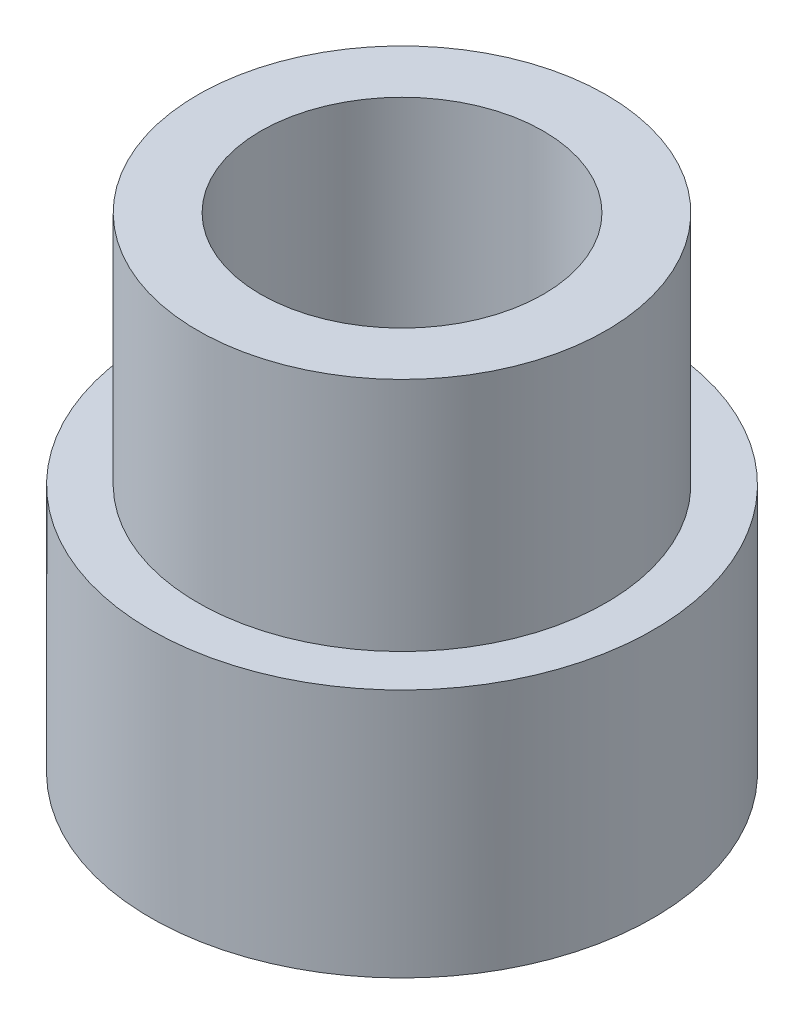
ISO-10303-21;
HEADER;
FILE_DESCRIPTION(('STEP AP214'),'2;1');
FILE_NAME('part.step','',(''),(''),'','','');
FILE_SCHEMA(('AUTOMOTIVE_DESIGN { 1 0 10303 214 1 1 1 1 }'));
ENDSEC;
DATA;
#1=APPLICATION_CONTEXT('core data for automotive mechanical design processes');
#2=APPLICATION_PROTOCOL_DEFINITION('international standard','automotive_design',2000,#1);
#3=PRODUCT_CONTEXT('',#1,'mechanical');
#4=PRODUCT('Part','Part','',(#3));
#5=PRODUCT_RELATED_PRODUCT_CATEGORY('part','',(#4));
#6=PRODUCT_DEFINITION_FORMATION('','',#4);
#7=PRODUCT_DEFINITION_CONTEXT('part definition',#1,'design');
#8=PRODUCT_DEFINITION('design','',#6,#7);
#9=PRODUCT_DEFINITION_SHAPE('','',#8);
#10=(LENGTH_UNIT() NAMED_UNIT(*) SI_UNIT(.MILLI.,.METRE.));
#11=(NAMED_UNIT(*) PLANE_ANGLE_UNIT() SI_UNIT($,.RADIAN.));
#12=(NAMED_UNIT(*) SI_UNIT($,.STERADIAN.) SOLID_ANGLE_UNIT());
#13=UNCERTAINTY_MEASURE_WITH_UNIT(LENGTH_MEASURE(1.E-05),#10,'distance_accuracy_value','');
#14=(GEOMETRIC_REPRESENTATION_CONTEXT(3) GLOBAL_UNCERTAINTY_ASSIGNED_CONTEXT((#13)) GLOBAL_UNIT_ASSIGNED_CONTEXT((#10,
#11,#12)) REPRESENTATION_CONTEXT('',''));
#15=CARTESIAN_POINT('',(0.,0.,0.));
#16=DIRECTION('',(0.,0.,1.));
#17=DIRECTION('',(1.,0.,0.));
#18=AXIS2_PLACEMENT_3D('',#15,#16,#17);
#19=CARTESIAN_POINT('',(0.,10.,0.));
#20=DIRECTION('',(0.,-1.,0.));
#21=DIRECTION('',(0.,0.,-1.));
#22=AXIS2_PLACEMENT_3D('',#19,#20,#21);
#23=CYLINDRICAL_SURFACE('',#22,4.6355);
#24=CARTESIAN_POINT('',(0.,-10.16,0.));
#25=DIRECTION('',(0.,-1.,0.));
#26=DIRECTION('',(0.,0.,-1.));
#27=AXIS2_PLACEMENT_3D('',#24,#25,#26);
#28=CIRCLE('',#27,4.6355);
#29=CARTESIAN_POINT('',(0.,-10.16,-4.6355));
#30=VERTEX_POINT('',#29);
#31=EDGE_CURVE('E53',#30,#30,#28,.T.);
#32=ORIENTED_EDGE('',*,*,#31,.T.);
#33=EDGE_LOOP('',(#32));
#34=FACE_BOUND('',#33,.T.);
#35=CARTESIAN_POINT('',(0.,-3.5,0.));
#36=DIRECTION('',(0.,1.,0.));
#37=DIRECTION('',(0.,0.,1.));
#38=AXIS2_PLACEMENT_3D('',#35,#36,#37);
#39=CIRCLE('',#38,4.6355);
#40=CARTESIAN_POINT('',(0.,-3.5,4.6355));
#41=VERTEX_POINT('',#40);
#42=EDGE_CURVE('E34',#41,#41,#39,.T.);
#43=ORIENTED_EDGE('',*,*,#42,.T.);
#44=EDGE_LOOP('',(#43));
#45=FACE_BOUND('',#44,.T.);
#46=ADVANCED_FACE('F30',(#34,#45),#23,.F.);
#47=CARTESIAN_POINT('',(0.,10.,0.));
#48=DIRECTION('',(0.,1.,0.));
#49=DIRECTION('',(0.,0.,1.));
#50=AXIS2_PLACEMENT_3D('',#47,#48,#49);
#51=PLANE('',#50);
#52=CARTESIAN_POINT('',(0.,10.,0.));
#53=DIRECTION('',(0.,1.,0.));
#54=DIRECTION('',(0.,0.,1.));
#55=AXIS2_PLACEMENT_3D('',#52,#53,#54);
#56=CIRCLE('',#55,16.51);
#57=CARTESIAN_POINT('',(0.,10.,-16.51));
#58=VERTEX_POINT('',#57);
#59=EDGE_CURVE('E10',#58,#58,#56,.T.);
#60=ORIENTED_EDGE('',*,*,#59,.F.);
#61=EDGE_LOOP('',(#60));
#62=FACE_BOUND('',#61,.T.);
#63=CARTESIAN_POINT('',(0.,10.,0.));
#64=DIRECTION('',(0.,1.,0.));
#65=DIRECTION('',(0.,0.,1.));
#66=AXIS2_PLACEMENT_3D('',#63,#64,#65);
#67=CIRCLE('',#66,20.32);
#68=CARTESIAN_POINT('',(0.,10.,20.32));
#69=VERTEX_POINT('',#68);
#70=EDGE_CURVE('E38',#69,#69,#67,.T.);
#71=ORIENTED_EDGE('',*,*,#70,.T.);
#72=EDGE_LOOP('',(#71));
#73=FACE_BOUND('',#72,.T.);
#74=ADVANCED_FACE('F81',(#62,#73),#51,.T.);
#75=CARTESIAN_POINT('',(0.,10.,0.));
#76=DIRECTION('',(0.,-1.,0.));
#77=DIRECTION('',(0.,0.,-1.));
#78=AXIS2_PLACEMENT_3D('',#75,#76,#77);
#79=CYLINDRICAL_SURFACE('',#78,20.32);
#80=ORIENTED_EDGE('',*,*,#70,.F.);
#81=EDGE_LOOP('',(#80));
#82=FACE_BOUND('',#81,.T.);
#83=CARTESIAN_POINT('',(0.,-10.16,0.));
#84=DIRECTION('',(0.,-1.,0.));
#85=DIRECTION('',(0.,0.,-1.));
#86=AXIS2_PLACEMENT_3D('',#83,#84,#85);
#87=CIRCLE('',#86,20.32);
#88=CARTESIAN_POINT('',(0.,-10.16,-20.32));
#89=VERTEX_POINT('',#88);
#90=EDGE_CURVE('E50',#89,#89,#87,.T.);
#91=ORIENTED_EDGE('',*,*,#90,.F.);
#92=EDGE_LOOP('',(#91));
#93=FACE_BOUND('',#92,.T.);
#94=ADVANCED_FACE('F32',(#82,#93),#79,.T.);
#95=CARTESIAN_POINT('',(0.,29.05,0.));
#96=DIRECTION('',(0.,1.,0.));
#97=DIRECTION('',(0.,0.,1.));
#98=AXIS2_PLACEMENT_3D('',#95,#96,#97);
#99=PLANE('',#98);
#100=CARTESIAN_POINT('',(0.,29.05,0.));
#101=DIRECTION('',(0.,1.,0.));
#102=DIRECTION('',(0.,0.,1.));
#103=AXIS2_PLACEMENT_3D('',#100,#101,#102);
#104=CIRCLE('',#103,16.51);
#105=CARTESIAN_POINT('',(0.,29.05,-16.51));
#106=VERTEX_POINT('',#105);
#107=EDGE_CURVE('E43',#106,#106,#104,.T.);
#108=ORIENTED_EDGE('',*,*,#107,.T.);
#109=EDGE_LOOP('',(#108));
#110=FACE_BOUND('',#109,.T.);
#111=CARTESIAN_POINT('',(0.,29.05,0.));
#112=DIRECTION('',(0.,1.,0.));
#113=DIRECTION('',(0.,0.,1.));
#114=AXIS2_PLACEMENT_3D('',#111,#112,#113);
#115=CIRCLE('',#114,11.43);
#116=CARTESIAN_POINT('',(0.,29.05,-11.43));
#117=VERTEX_POINT('',#116);
#118=EDGE_CURVE('E47',#117,#117,#115,.T.);
#119=ORIENTED_EDGE('',*,*,#118,.F.);
#120=EDGE_LOOP('',(#119));
#121=FACE_BOUND('',#120,.T.);
#122=ADVANCED_FACE('F93',(#110,#121),#99,.T.);
#123=CARTESIAN_POINT('',(0.,29.05,0.));
#124=DIRECTION('',(0.,-1.,0.));
#125=DIRECTION('',(0.,0.,-1.));
#126=AXIS2_PLACEMENT_3D('',#123,#124,#125);
#127=CYLINDRICAL_SURFACE('',#126,16.51);
#128=CARTESIAN_POINT('',(0.,29.05,-16.51));
#129=CARTESIAN_POINT('',(0.,28.8515625,-16.51));
#130=CARTESIAN_POINT('',(0.,28.653125,-16.51));
#131=CARTESIAN_POINT('',(0.,28.25625,-16.51));
#132=CARTESIAN_POINT('',(0.,28.0578125,-16.51));
#133=CARTESIAN_POINT('',(0.,27.6609375,-16.51));
#134=CARTESIAN_POINT('',(0.,27.4625,-16.51));
#135=CARTESIAN_POINT('',(0.,27.065625,-16.51));
#136=CARTESIAN_POINT('',(0.,26.8671875,-16.51));
#137=CARTESIAN_POINT('',(0.,26.4703125,-16.51));
#138=CARTESIAN_POINT('',(0.,26.271875,-16.51));
#139=CARTESIAN_POINT('',(0.,25.875,-16.51));
#140=CARTESIAN_POINT('',(0.,25.6765625,-16.51));
#141=CARTESIAN_POINT('',(0.,25.2796875,-16.51));
#142=CARTESIAN_POINT('',(0.,25.08125,-16.51));
#143=CARTESIAN_POINT('',(0.,24.684375,-16.51));
#144=CARTESIAN_POINT('',(0.,24.4859375,-16.51));
#145=CARTESIAN_POINT('',(0.,24.0890625,-16.51));
#146=CARTESIAN_POINT('',(0.,23.890625,-16.51));
#147=CARTESIAN_POINT('',(0.,23.49375,-16.51));
#148=CARTESIAN_POINT('',(0.,23.2953125,-16.51));
#149=CARTESIAN_POINT('',(0.,22.8984375,-16.51));
#150=CARTESIAN_POINT('',(0.,22.7,-16.51));
#151=CARTESIAN_POINT('',(0.,22.303125,-16.51));
#152=CARTESIAN_POINT('',(0.,22.1046875,-16.51));
#153=CARTESIAN_POINT('',(0.,21.7078125,-16.51));
#154=CARTESIAN_POINT('',(0.,21.509375,-16.51));
#155=CARTESIAN_POINT('',(0.,21.1125,-16.51));
#156=CARTESIAN_POINT('',(0.,20.9140625,-16.51));
#157=CARTESIAN_POINT('',(0.,20.5171875,-16.51));
#158=CARTESIAN_POINT('',(0.,20.31875,-16.51));
#159=CARTESIAN_POINT('',(0.,19.921875,-16.51));
#160=CARTESIAN_POINT('',(0.,19.7234375,-16.51));
#161=CARTESIAN_POINT('',(0.,19.3265625,-16.51));
#162=CARTESIAN_POINT('',(0.,19.128125,-16.51));
#163=CARTESIAN_POINT('',(0.,18.73125,-16.51));
#164=CARTESIAN_POINT('',(0.,18.5328125,-16.51));
#165=CARTESIAN_POINT('',(0.,18.1359375,-16.51));
#166=CARTESIAN_POINT('',(0.,17.9375,-16.51));
#167=CARTESIAN_POINT('',(0.,17.540625,-16.51));
#168=CARTESIAN_POINT('',(0.,17.3421875,-16.51));
#169=CARTESIAN_POINT('',(0.,16.9453125,-16.51));
#170=CARTESIAN_POINT('',(0.,16.746875,-16.51));
#171=CARTESIAN_POINT('',(0.,16.35,-16.51));
#172=CARTESIAN_POINT('',(0.,16.1515625,-16.51));
#173=CARTESIAN_POINT('',(0.,15.7546875,-16.51));
#174=CARTESIAN_POINT('',(0.,15.55625,-16.51));
#175=CARTESIAN_POINT('',(0.,15.159375,-16.51));
#176=CARTESIAN_POINT('',(0.,14.9609375,-16.51));
#177=CARTESIAN_POINT('',(0.,14.5640625,-16.51));
#178=CARTESIAN_POINT('',(0.,14.365625,-16.51));
#179=CARTESIAN_POINT('',(0.,13.96875,-16.51));
#180=CARTESIAN_POINT('',(0.,13.7703125,-16.51));
#181=CARTESIAN_POINT('',(0.,13.3734375,-16.51));
#182=CARTESIAN_POINT('',(0.,13.175,-16.51));
#183=CARTESIAN_POINT('',(0.,12.778125,-16.51));
#184=CARTESIAN_POINT('',(0.,12.5796875,-16.51));
#185=CARTESIAN_POINT('',(0.,12.1828125,-16.51));
#186=CARTESIAN_POINT('',(0.,11.984375,-16.51));
#187=CARTESIAN_POINT('',(0.,11.5875,-16.51));
#188=CARTESIAN_POINT('',(0.,11.3890625,-16.51));
#189=CARTESIAN_POINT('',(0.,10.9921875,-16.51));
#190=CARTESIAN_POINT('',(0.,10.79375,-16.51));
#191=CARTESIAN_POINT('',(0.,10.396875,-16.51));
#192=CARTESIAN_POINT('',(0.,10.1984375,-16.51));
#193=CARTESIAN_POINT('',(0.,10.,-16.51));
#194=B_SPLINE_CURVE_WITH_KNOTS('',3,(#128,#129,#130,#131,#132,#133,#134,#135,#136,#137,#138,
#139,#140,#141,#142,#143,#144,#145,#146,#147,#148,#149,#150,#151,#152,#153,#154,#155,#156,#157,
#158,#159,#160,#161,#162,#163,#164,#165,#166,#167,#168,#169,#170,#171,#172,#173,#174,#175,#176,
#177,#178,#179,#180,#181,#182,#183,#184,#185,#186,#187,#188,#189,#190,#191,#192,#193),
.UNSPECIFIED.,.F.,.F.,(4,2,2,2,2,2,2,2,2,2,2,2,2,2,2,2,2,2,2,2,2,2,2,2,2,2,2,2,2,2,2,2,4),(0.,
0.595312499999997,1.190625,1.7859375,2.38125,2.9765625,3.571875,4.1671875,4.7625,5.3578125,
5.953125,6.5484375,7.14375,7.7390625,8.33437499999999,8.92968749999999,9.525,10.1203125,
10.715625,11.3109375,11.90625,12.5015625,13.096875,13.6921875,14.2875,14.8828125,15.478125,
16.0734375,16.66875,17.2640625,17.859375,18.4546875,19.05),.UNSPECIFIED.);
#195=EDGE_CURVE('BSEAM89',#106,#58,#194,.T.);
#196=ORIENTED_EDGE('',*,*,#107,.F.);
#197=ORIENTED_EDGE('',*,*,#59,.T.);
#198=ORIENTED_EDGE('',*,*,#195,.T.);
#199=ORIENTED_EDGE('',*,*,#195,.F.);
#200=EDGE_LOOP('',(#196,#198,#197,#199));
#201=FACE_BOUND('',#200,.T.);
#202=ADVANCED_FACE('F89',(#201),#127,.T.);
#203=CARTESIAN_POINT('',(0.,29.05,0.));
#204=DIRECTION('',(0.,-1.,0.));
#205=DIRECTION('',(0.,0.,-1.));
#206=AXIS2_PLACEMENT_3D('',#203,#204,#205);
#207=CYLINDRICAL_SURFACE('',#206,11.43);
#208=CARTESIAN_POINT('',(0.,-2.,0.));
#209=DIRECTION('',(0.,1.,0.));
#210=DIRECTION('',(0.,0.,1.));
#211=AXIS2_PLACEMENT_3D('',#208,#209,#210);
#212=CIRCLE('',#211,11.43);
#213=CARTESIAN_POINT('',(0.,-2.,-11.43));
#214=VERTEX_POINT('',#213);
#215=EDGE_CURVE('E56',#214,#214,#212,.T.);
#216=CARTESIAN_POINT('',(0.,29.05,-11.43));
#217=CARTESIAN_POINT('',(0.,28.7265625,-11.43));
#218=CARTESIAN_POINT('',(0.,28.403125,-11.43));
#219=CARTESIAN_POINT('',(0.,27.75625,-11.43));
#220=CARTESIAN_POINT('',(0.,27.4328125,-11.43));
#221=CARTESIAN_POINT('',(0.,26.7859375,-11.43));
#222=CARTESIAN_POINT('',(0.,26.4625,-11.43));
#223=CARTESIAN_POINT('',(0.,25.815625,-11.43));
#224=CARTESIAN_POINT('',(0.,25.4921875,-11.43));
#225=CARTESIAN_POINT('',(0.,24.8453125,-11.43));
#226=CARTESIAN_POINT('',(0.,24.521875,-11.43));
#227=CARTESIAN_POINT('',(0.,23.875,-11.43));
#228=CARTESIAN_POINT('',(0.,23.5515625,-11.43));
#229=CARTESIAN_POINT('',(0.,22.9046875,-11.43));
#230=CARTESIAN_POINT('',(0.,22.58125,-11.43));
#231=CARTESIAN_POINT('',(0.,21.934375,-11.43));
#232=CARTESIAN_POINT('',(0.,21.6109375,-11.43));
#233=CARTESIAN_POINT('',(0.,20.9640625,-11.43));
#234=CARTESIAN_POINT('',(0.,20.640625,-11.43));
#235=CARTESIAN_POINT('',(0.,19.99375,-11.43));
#236=CARTESIAN_POINT('',(0.,19.6703125,-11.43));
#237=CARTESIAN_POINT('',(0.,19.0234375,-11.43));
#238=CARTESIAN_POINT('',(0.,18.7,-11.43));
#239=CARTESIAN_POINT('',(0.,18.053125,-11.43));
#240=CARTESIAN_POINT('',(0.,17.7296875,-11.43));
#241=CARTESIAN_POINT('',(0.,17.0828125,-11.43));
#242=CARTESIAN_POINT('',(0.,16.759375,-11.43));
#243=CARTESIAN_POINT('',(0.,16.1125,-11.43));
#244=CARTESIAN_POINT('',(0.,15.7890625,-11.43));
#245=CARTESIAN_POINT('',(0.,15.1421875,-11.43));
#246=CARTESIAN_POINT('',(0.,14.81875,-11.43));
#247=CARTESIAN_POINT('',(0.,14.171875,-11.43));
#248=CARTESIAN_POINT('',(0.,13.8484375,-11.43));
#249=CARTESIAN_POINT('',(0.,13.2015625,-11.43));
#250=CARTESIAN_POINT('',(0.,12.878125,-11.43));
#251=CARTESIAN_POINT('',(0.,12.23125,-11.43));
#252=CARTESIAN_POINT('',(0.,11.9078125,-11.43));
#253=CARTESIAN_POINT('',(0.,11.2609375,-11.43));
#254=CARTESIAN_POINT('',(0.,10.9375,-11.43));
#255=CARTESIAN_POINT('',(0.,10.290625,-11.43));
#256=CARTESIAN_POINT('',(0.,9.9671875,-11.43));
#257=CARTESIAN_POINT('',(0.,9.3203125,-11.43));
#258=CARTESIAN_POINT('',(0.,8.996875,-11.43));
#259=CARTESIAN_POINT('',(0.,8.35,-11.43));
#260=CARTESIAN_POINT('',(0.,8.0265625,-11.43));
#261=CARTESIAN_POINT('',(0.,7.3796875,-11.43));
#262=CARTESIAN_POINT('',(0.,7.05625,-11.43));
#263=CARTESIAN_POINT('',(0.,6.409375,-11.43));
#264=CARTESIAN_POINT('',(0.,6.0859375,-11.43));
#265=CARTESIAN_POINT('',(0.,5.4390625,-11.43));
#266=CARTESIAN_POINT('',(0.,5.115625,-11.43));
#267=CARTESIAN_POINT('',(0.,4.46875,-11.43));
#268=CARTESIAN_POINT('',(0.,4.1453125,-11.43));
#269=CARTESIAN_POINT('',(0.,3.4984375,-11.43));
#270=CARTESIAN_POINT('',(0.,3.175,-11.43));
#271=CARTESIAN_POINT('',(0.,2.528125,-11.43));
#272=CARTESIAN_POINT('',(0.,2.2046875,-11.43));
#273=CARTESIAN_POINT('',(0.,1.5578125,-11.43));
#274=CARTESIAN_POINT('',(0.,1.234375,-11.43));
#275=CARTESIAN_POINT('',(0.,0.587500000000001,-11.43));
#276=CARTESIAN_POINT('',(0.,0.264062500000002,-11.43));
#277=CARTESIAN_POINT('',(0.,-0.382812499999997,-11.43));
#278=CARTESIAN_POINT('',(0.,-0.706249999999997,-11.43));
#279=CARTESIAN_POINT('',(0.,-1.353125,-11.43));
#280=CARTESIAN_POINT('',(0.,-1.6765625,-11.43));
#281=CARTESIAN_POINT('',(0.,-2.,-11.43));
#282=B_SPLINE_CURVE_WITH_KNOTS('',3,(#216,#217,#218,#219,#220,#221,#222,#223,#224,#225,#226,
#227,#228,#229,#230,#231,#232,#233,#234,#235,#236,#237,#238,#239,#240,#241,#242,#243,#244,#245,
#246,#247,#248,#249,#250,#251,#252,#253,#254,#255,#256,#257,#258,#259,#260,#261,#262,#263,#264,
#265,#266,#267,#268,#269,#270,#271,#272,#273,#274,#275,#276,#277,#278,#279,#280,#281),
.UNSPECIFIED.,.F.,.F.,(4,2,2,2,2,2,2,2,2,2,2,2,2,2,2,2,2,2,2,2,2,2,2,2,2,2,2,2,2,2,2,2,4),(0.,
0.970312500000001,1.940625,2.9109375,3.88125,4.8515625,5.821875,6.7921875,7.7625,8.7328125,
9.703125,10.6734375,11.64375,12.6140625,13.584375,14.5546875,15.525,16.4953125,17.465625,
18.4359375,19.40625,20.3765625,21.346875,22.3171875,23.2875,24.2578125,25.228125,26.1984375,
27.16875,28.1390625,29.109375,30.0796875,31.05),.UNSPECIFIED.);
#283=EDGE_CURVE('BSEAM92',#117,#214,#282,.T.);
#284=ORIENTED_EDGE('',*,*,#118,.T.);
#285=ORIENTED_EDGE('',*,*,#215,.F.);
#286=ORIENTED_EDGE('',*,*,#283,.T.);
#287=ORIENTED_EDGE('',*,*,#283,.F.);
#288=EDGE_LOOP('',(#284,#286,#285,#287));
#289=FACE_BOUND('',#288,.T.);
#290=ADVANCED_FACE('F92',(#289),#207,.F.);
#291=CARTESIAN_POINT('',(0.,-10.16,0.));
#292=DIRECTION('',(0.,-1.,0.));
#293=DIRECTION('',(0.,0.,-1.));
#294=AXIS2_PLACEMENT_3D('',#291,#292,#293);
#295=PLANE('',#294);
#296=ORIENTED_EDGE('',*,*,#90,.T.);
#297=EDGE_LOOP('',(#296));
#298=FACE_BOUND('',#297,.T.);
#299=ORIENTED_EDGE('',*,*,#31,.F.);
#300=EDGE_LOOP('',(#299));
#301=FACE_BOUND('',#300,.T.);
#302=ADVANCED_FACE('F100',(#298,#301),#295,.T.);
#303=CARTESIAN_POINT('',(0.,-2.,0.));
#304=DIRECTION('',(0.,1.,0.));
#305=DIRECTION('',(0.,0.,1.));
#306=AXIS2_PLACEMENT_3D('',#303,#304,#305);
#307=PLANE('',#306);
#308=CARTESIAN_POINT('',(0.,-2.,0.));
#309=DIRECTION('',(0.,1.,0.));
#310=DIRECTION('',(0.,0.,1.));
#311=AXIS2_PLACEMENT_3D('',#308,#309,#310);
#312=CIRCLE('',#311,8.5);
#313=CARTESIAN_POINT('',(0.,-2.,8.5));
#314=VERTEX_POINT('',#313);
#315=EDGE_CURVE('E59',#314,#314,#312,.T.);
#316=ORIENTED_EDGE('',*,*,#315,.F.);
#317=EDGE_LOOP('',(#316));
#318=FACE_BOUND('',#317,.T.);
#319=ORIENTED_EDGE('',*,*,#215,.T.);
#320=EDGE_LOOP('',(#319));
#321=FACE_BOUND('',#320,.T.);
#322=ADVANCED_FACE('F77',(#318,#321),#307,.T.);
#323=CARTESIAN_POINT('',(0.,-3.5,0.));
#324=DIRECTION('',(0.,1.,0.));
#325=DIRECTION('',(0.,0.,1.));
#326=AXIS2_PLACEMENT_3D('',#323,#324,#325);
#327=CYLINDRICAL_SURFACE('',#326,8.5);
#328=CARTESIAN_POINT('',(0.,-3.5,0.));
#329=DIRECTION('',(0.,1.,0.));
#330=DIRECTION('',(0.,0.,1.));
#331=AXIS2_PLACEMENT_3D('',#328,#329,#330);
#332=CIRCLE('',#331,8.5);
#333=CARTESIAN_POINT('',(0.,-3.5,8.5));
#334=VERTEX_POINT('',#333);
#335=EDGE_CURVE('E62',#334,#334,#332,.T.);
#336=ORIENTED_EDGE('',*,*,#335,.F.);
#337=EDGE_LOOP('',(#336));
#338=FACE_BOUND('',#337,.T.);
#339=ORIENTED_EDGE('',*,*,#315,.T.);
#340=EDGE_LOOP('',(#339));
#341=FACE_BOUND('',#340,.T.);
#342=ADVANCED_FACE('F72',(#338,#341),#327,.F.);
#343=CARTESIAN_POINT('',(0.,-3.5,0.));
#344=DIRECTION('',(0.,1.,0.));
#345=DIRECTION('',(0.,0.,1.));
#346=AXIS2_PLACEMENT_3D('',#343,#344,#345);
#347=PLANE('',#346);
#348=ORIENTED_EDGE('',*,*,#42,.F.);
#349=EDGE_LOOP('',(#348));
#350=FACE_BOUND('',#349,.T.);
#351=ORIENTED_EDGE('',*,*,#335,.T.);
#352=EDGE_LOOP('',(#351));
#353=FACE_BOUND('',#352,.T.);
#354=ADVANCED_FACE('F70',(#350,#353),#347,.T.);
#355=CLOSED_SHELL('',(#46,#74,#94,#122,#202,#290,#302,#322,#342,#354));
#356=MANIFOLD_SOLID_BREP('B2',#355);
#357=ADVANCED_BREP_SHAPE_REPRESENTATION('',(#18,#356),#14);
#358=SHAPE_DEFINITION_REPRESENTATION(#9,#357);
ENDSEC;
END-ISO-10303-21;
